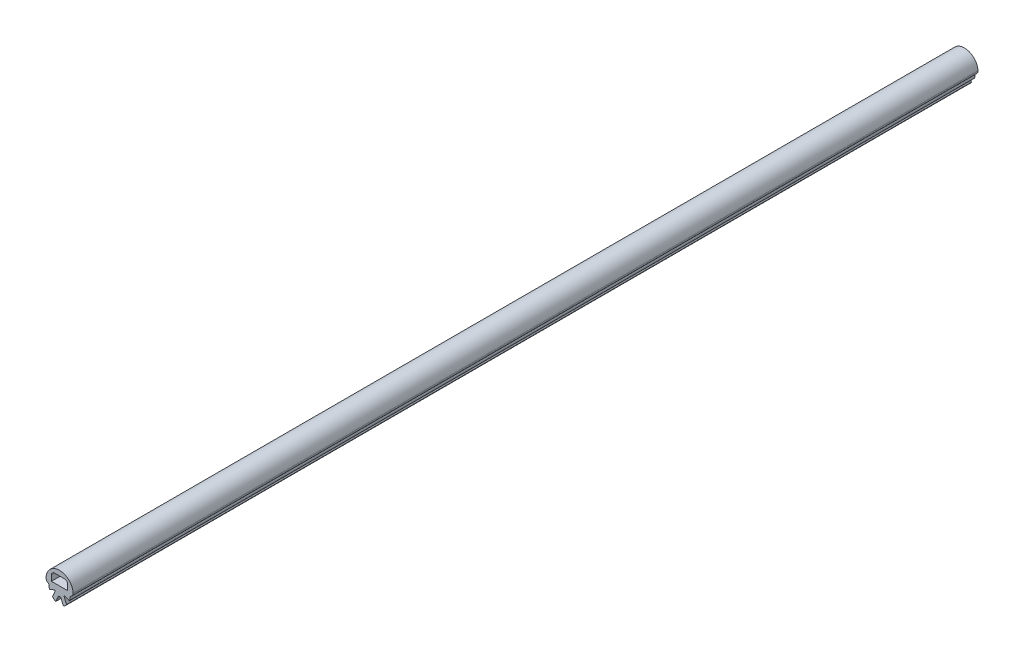
ISO-10303-21;
HEADER;
FILE_DESCRIPTION(('STEP AP214'),'2;1');
FILE_NAME('part.step','',(''),(''),'','','');
FILE_SCHEMA(('AUTOMOTIVE_DESIGN { 1 0 10303 214 1 1 1 1 }'));
ENDSEC;
DATA;
#1=APPLICATION_CONTEXT('core data for automotive mechanical design processes');
#2=APPLICATION_PROTOCOL_DEFINITION('international standard','automotive_design',2000,#1);
#3=PRODUCT_CONTEXT('',#1,'mechanical');
#4=PRODUCT('Part','Part','',(#3));
#5=PRODUCT_RELATED_PRODUCT_CATEGORY('part','',(#4));
#6=PRODUCT_DEFINITION_FORMATION('','',#4);
#7=PRODUCT_DEFINITION_CONTEXT('part definition',#1,'design');
#8=PRODUCT_DEFINITION('design','',#6,#7);
#9=PRODUCT_DEFINITION_SHAPE('','',#8);
#10=(LENGTH_UNIT() NAMED_UNIT(*) SI_UNIT(.MILLI.,.METRE.));
#11=(NAMED_UNIT(*) PLANE_ANGLE_UNIT() SI_UNIT($,.RADIAN.));
#12=(NAMED_UNIT(*) SI_UNIT($,.STERADIAN.) SOLID_ANGLE_UNIT());
#13=UNCERTAINTY_MEASURE_WITH_UNIT(LENGTH_MEASURE(1.E-05),#10,'distance_accuracy_value','');
#14=(GEOMETRIC_REPRESENTATION_CONTEXT(3) GLOBAL_UNCERTAINTY_ASSIGNED_CONTEXT((#13)) GLOBAL_UNIT_ASSIGNED_CONTEXT((#10,
#11,#12)) REPRESENTATION_CONTEXT('',''));
#15=CARTESIAN_POINT('',(0.,0.,0.));
#16=DIRECTION('',(0.,0.,1.));
#17=DIRECTION('',(1.,0.,0.));
#18=AXIS2_PLACEMENT_3D('',#15,#16,#17);
#19=CARTESIAN_POINT('',(-6.47113248654049,-11.6533832902364,17.5643148085863));
#20=DIRECTION('',(-0.866025403784436,-0.500000000000005,0.));
#21=DIRECTION('',(0.500000000000005,-0.866025403784436,0.));
#22=AXIS2_PLACEMENT_3D('',#19,#20,#21);
#23=PLANE('',#22);
#24=DIRECTION('',(0.,0.,-1.));
#25=VECTOR('',#24,1.);
#26=CARTESIAN_POINT('',(-8.95886950491573,-7.34449637854067,17.5643148085863));
#27=LINE('',#26,#25);
#28=CARTESIAN_POINT('',(-8.95886950491573,-7.34449637854067,-57.));
#29=VERTEX_POINT('',#28);
#30=CARTESIAN_POINT('',(-8.95886950491573,-7.34449637854067,-891.));
#31=VERTEX_POINT('',#30);
#32=EDGE_CURVE('E401',#29,#31,#27,.T.);
#33=ORIENTED_EDGE('',*,*,#32,.F.);
#34=DIRECTION('',(-0.500000000000005,0.866025403784436,0.));
#35=VECTOR('',#34,1.);
#36=CARTESIAN_POINT('',(-6.47113248654049,-11.6533832902364,-57.));
#37=LINE('',#36,#35);
#38=CARTESIAN_POINT('',(-9.20528257003529,-6.91769643010482,-57.));
#39=VERTEX_POINT('',#38);
#40=EDGE_CURVE('E333',#29,#39,#37,.T.);
#41=ORIENTED_EDGE('',*,*,#40,.T.);
#42=DIRECTION('',(0.,0.,-1.));
#43=VECTOR('',#42,1.);
#44=CARTESIAN_POINT('',(-9.20528257003529,-6.91769643010482,17.5643148085863));
#45=LINE('',#44,#43);
#46=CARTESIAN_POINT('',(-9.20528257003529,-6.91769643010482,-891.));
#47=VERTEX_POINT('',#46);
#48=EDGE_CURVE('E335',#39,#47,#45,.T.);
#49=ORIENTED_EDGE('',*,*,#48,.T.);
#50=DIRECTION('',(-0.500000000000005,0.866025403784436,0.));
#51=VECTOR('',#50,1.);
#52=CARTESIAN_POINT('',(-6.47113248654049,-11.6533832902364,-891.));
#53=LINE('',#52,#51);
#54=EDGE_CURVE('E372',#31,#47,#53,.T.);
#55=ORIENTED_EDGE('',*,*,#54,.F.);
#56=EDGE_LOOP('',(#33,#41,#49,#55));
#57=FACE_BOUND('',#56,.T.);
#58=ADVANCED_FACE('F48',(#57),#23,.T.);
#59=CARTESIAN_POINT('',(9.20528257003505,-6.91769643010493,17.5643148085863));
#60=DIRECTION('',(0.866025403784431,-0.500000000000013,0.));
#61=DIRECTION('',(0.500000000000013,0.866025403784431,0.));
#62=AXIS2_PLACEMENT_3D('',#59,#60,#61);
#63=PLANE('',#62);
#64=DIRECTION('',(0.,0.,1.));
#65=VECTOR('',#64,1.);
#66=CARTESIAN_POINT('',(8.95886950491558,-7.3444963785406,17.5643148085863));
#67=LINE('',#66,#65);
#68=CARTESIAN_POINT('',(8.95886950491558,-7.3444963785406,-891.));
#69=VERTEX_POINT('',#68);
#70=CARTESIAN_POINT('',(8.95886950491558,-7.3444963785406,-57.));
#71=VERTEX_POINT('',#70);
#72=EDGE_CURVE('E395',#69,#71,#67,.T.);
#73=ORIENTED_EDGE('',*,*,#72,.F.);
#74=DIRECTION('',(-0.500000000000013,-0.866025403784431,0.));
#75=VECTOR('',#74,1.);
#76=CARTESIAN_POINT('',(9.20528257003505,-6.91769643010493,-891.));
#77=LINE('',#76,#75);
#78=CARTESIAN_POINT('',(9.20528257003505,-6.91769643010492,-891.));
#79=VERTEX_POINT('',#78);
#80=EDGE_CURVE('E364',#79,#69,#77,.T.);
#81=ORIENTED_EDGE('',*,*,#80,.F.);
#82=DIRECTION('',(0.,0.,-1.));
#83=VECTOR('',#82,1.);
#84=CARTESIAN_POINT('',(9.20528257003505,-6.91769643010492,17.5643148085863));
#85=LINE('',#84,#83);
#86=CARTESIAN_POINT('',(9.20528257003505,-6.91769643010492,-57.));
#87=VERTEX_POINT('',#86);
#88=EDGE_CURVE('E321',#87,#79,#85,.T.);
#89=ORIENTED_EDGE('',*,*,#88,.F.);
#90=DIRECTION('',(-0.500000000000013,-0.866025403784431,0.));
#91=VECTOR('',#90,1.);
#92=CARTESIAN_POINT('',(9.20528257003505,-6.91769643010493,-57.));
#93=LINE('',#92,#91);
#94=EDGE_CURVE('E329',#87,#71,#93,.T.);
#95=ORIENTED_EDGE('',*,*,#94,.T.);
#96=EDGE_LOOP('',(#73,#81,#89,#95));
#97=FACE_BOUND('',#96,.T.);
#98=ADVANCED_FACE('F437',(#97),#63,.T.);
#99=CARTESIAN_POINT('',(8.50059730669662,0.499492278712982,17.5643148085863));
#100=DIRECTION('',(0.,0.,-1.));
#101=DIRECTION('',(-1.,0.,0.));
#102=AXIS2_PLACEMENT_3D('',#99,#100,#101);
#103=CYLINDRICAL_SURFACE('',#102,4.00000000000114);
#104=DIRECTION('',(0.,0.,-1.));
#105=VECTOR('',#104,1.);
#106=CARTESIAN_POINT('',(12.4961385352011,0.310679431347746,-474.));
#107=LINE('',#106,#105);
#108=CARTESIAN_POINT('',(12.4961385352011,0.310679431347746,-56.9999999999999));
#109=VERTEX_POINT('',#108);
#110=CARTESIAN_POINT('',(12.4961385352011,0.310679431347746,-891.));
#111=VERTEX_POINT('',#110);
#112=EDGE_CURVE('E342',#109,#111,#107,.T.);
#113=ORIENTED_EDGE('',*,*,#112,.F.);
#114=CARTESIAN_POINT('',(8.50059730669662,0.499492278712982,-57.));
#115=DIRECTION('',(0.,0.,1.));
#116=DIRECTION('',(1.,0.,0.));
#117=AXIS2_PLACEMENT_3D('',#114,#115,#116);
#118=CIRCLE('',#117,4.00000000000114);
#119=CARTESIAN_POINT('',(9.43762749865645,-3.38920601497925,-57.));
#120=VERTEX_POINT('',#119);
#121=EDGE_CURVE('E312',#109,#120,#118,.F.);
#122=ORIENTED_EDGE('',*,*,#121,.T.);
#123=DIRECTION('',(0.,0.,-1.));
#124=VECTOR('',#123,1.);
#125=CARTESIAN_POINT('',(9.43762749865645,-3.38920601497925,17.5643148085863));
#126=LINE('',#125,#124);
#127=CARTESIAN_POINT('',(9.43762749865645,-3.38920601497925,-891.));
#128=VERTEX_POINT('',#127);
#129=EDGE_CURVE('E317',#120,#128,#126,.T.);
#130=ORIENTED_EDGE('',*,*,#129,.T.);
#131=CARTESIAN_POINT('',(8.50059730669662,0.499492278712982,-891.));
#132=DIRECTION('',(0.,0.,-1.));
#133=DIRECTION('',(-1.,0.,0.));
#134=AXIS2_PLACEMENT_3D('',#131,#132,#133);
#135=CIRCLE('',#134,4.00000000000114);
#136=EDGE_CURVE('E358',#111,#128,#135,.T.);
#137=ORIENTED_EDGE('',*,*,#136,.F.);
#138=EDGE_LOOP('',(#113,#122,#130,#137));
#139=FACE_BOUND('',#138,.T.);
#140=ADVANCED_FACE('F444',(#139),#103,.T.);
#141=CARTESIAN_POINT('',(-8.50059730669262,0.499492278712978,17.5643148085863));
#142=DIRECTION('',(0.,0.,-1.));
#143=DIRECTION('',(-1.,0.,0.));
#144=AXIS2_PLACEMENT_3D('',#141,#142,#143);
#145=CYLINDRICAL_SURFACE('',#144,4.00000000000114);
#146=DIRECTION('',(0.,0.,-1.));
#147=VECTOR('',#146,1.);
#148=CARTESIAN_POINT('',(-12.4961385351997,0.310679431403244,-474.));
#149=LINE('',#148,#147);
#150=CARTESIAN_POINT('',(-12.4961385351997,0.310679431403244,-891.));
#151=VERTEX_POINT('',#150);
#152=CARTESIAN_POINT('',(-12.4961385351997,0.310679431403244,-57.));
#153=VERTEX_POINT('',#152);
#154=EDGE_CURVE('E316',#151,#153,#149,.F.);
#155=ORIENTED_EDGE('',*,*,#154,.F.);
#156=CARTESIAN_POINT('',(-8.50059730669262,0.499492278712978,-891.));
#157=DIRECTION('',(0.,0.,-1.));
#158=DIRECTION('',(-1.,0.,0.));
#159=AXIS2_PLACEMENT_3D('',#156,#157,#158);
#160=CIRCLE('',#159,4.00000000000114);
#161=CARTESIAN_POINT('',(-9.43762749865635,-3.38920601497831,-891.));
#162=VERTEX_POINT('',#161);
#163=EDGE_CURVE('E346',#162,#151,#160,.T.);
#164=ORIENTED_EDGE('',*,*,#163,.F.);
#165=DIRECTION('',(0.,0.,-1.));
#166=VECTOR('',#165,1.);
#167=CARTESIAN_POINT('',(-9.43762749865635,-3.38920601497831,17.5643148085863));
#168=LINE('',#167,#166);
#169=CARTESIAN_POINT('',(-9.43762749865635,-3.38920601497831,-57.));
#170=VERTEX_POINT('',#169);
#171=EDGE_CURVE('E340',#170,#162,#168,.T.);
#172=ORIENTED_EDGE('',*,*,#171,.F.);
#173=CARTESIAN_POINT('',(-8.50059730669262,0.499492278712978,-57.));
#174=DIRECTION('',(0.,0.,1.));
#175=DIRECTION('',(1.,0.,0.));
#176=AXIS2_PLACEMENT_3D('',#173,#174,#175);
#177=CIRCLE('',#176,4.00000000000114);
#178=EDGE_CURVE('E320',#170,#153,#177,.F.);
#179=ORIENTED_EDGE('',*,*,#178,.T.);
#180=EDGE_LOOP('',(#155,#164,#172,#179));
#181=FACE_BOUND('',#180,.T.);
#182=ADVANCED_FACE('F50',(#181),#145,.T.);
#183=CARTESIAN_POINT('',(-5.49999999999569,-1.50000000000011,-891.));
#184=DIRECTION('',(0.,0.,-1.));
#185=DIRECTION('',(-1.,0.,0.));
#186=AXIS2_PLACEMENT_3D('',#183,#184,#185);
#187=PLANE('',#186);
#188=DIRECTION('',(0.,-1.,0.));
#189=VECTOR('',#188,1.);
#190=CARTESIAN_POINT('',(7.5,0.,-891.));
#191=LINE('',#190,#189);
#192=CARTESIAN_POINT('',(7.5,4.99999999999998,-891.));
#193=VERTEX_POINT('',#192);
#194=CARTESIAN_POINT('',(7.5,0.,-891.));
#195=VERTEX_POINT('',#194);
#196=EDGE_CURVE('E63',#193,#195,#191,.T.);
#197=ORIENTED_EDGE('',*,*,#196,.F.);
#198=CARTESIAN_POINT('',(4.5,5.,-891.));
#199=DIRECTION('',(0.,0.,-1.));
#200=DIRECTION('',(1.,0.,0.));
#201=AXIS2_PLACEMENT_3D('',#198,#199,#200);
#202=CIRCLE('',#201,3.);
#203=CARTESIAN_POINT('',(4.49999999999998,8.,-891.));
#204=VERTEX_POINT('',#203);
#205=EDGE_CURVE('E248',#204,#193,#202,.T.);
#206=ORIENTED_EDGE('',*,*,#205,.F.);
#207=DIRECTION('',(1.,0.,0.));
#208=VECTOR('',#207,1.);
#209=CARTESIAN_POINT('',(4.49999999999998,8.,-891.));
#210=LINE('',#209,#208);
#211=CARTESIAN_POINT('',(-4.49999999999998,8.,-891.));
#212=VERTEX_POINT('',#211);
#213=EDGE_CURVE('E242',#212,#204,#210,.T.);
#214=ORIENTED_EDGE('',*,*,#213,.F.);
#215=CARTESIAN_POINT('',(-4.5,5.,-891.));
#216=DIRECTION('',(0.,0.,-1.));
#217=DIRECTION('',(1.,0.,0.));
#218=AXIS2_PLACEMENT_3D('',#215,#216,#217);
#219=CIRCLE('',#218,3.);
#220=CARTESIAN_POINT('',(-7.5,4.99999999999998,-891.));
#221=VERTEX_POINT('',#220);
#222=EDGE_CURVE('E240',#221,#212,#219,.T.);
#223=ORIENTED_EDGE('',*,*,#222,.F.);
#224=DIRECTION('',(0.,1.,0.));
#225=VECTOR('',#224,1.);
#226=CARTESIAN_POINT('',(-7.5,0.,-891.));
#227=LINE('',#226,#225);
#228=CARTESIAN_POINT('',(-7.5,0.,-891.));
#229=VERTEX_POINT('',#228);
#230=EDGE_CURVE('E223',#229,#221,#227,.T.);
#231=ORIENTED_EDGE('',*,*,#230,.F.);
#232=DIRECTION('',(-1.,0.,0.));
#233=VECTOR('',#232,1.);
#234=CARTESIAN_POINT('',(7.5,0.,-891.));
#235=LINE('',#234,#233);
#236=EDGE_CURVE('E232',#195,#229,#235,.T.);
#237=ORIENTED_EDGE('',*,*,#236,.F.);
#238=EDGE_LOOP('',(#197,#206,#214,#223,#231,#237));
#239=FACE_BOUND('',#238,.T.);
#240=DIRECTION('',(0.910826243995696,0.412789962630747,0.));
#241=VECTOR('',#240,1.);
#242=CARTESIAN_POINT('',(-9.08644720520006,-7.40231508378774,-891.));
#243=LINE('',#242,#241);
#244=CARTESIAN_POINT('',(-4.53231598522158,-5.33836527063401,-891.));
#245=VERTEX_POINT('',#244);
#246=EDGE_CURVE('E264',#31,#245,#243,.T.);
#247=ORIENTED_EDGE('',*,*,#246,.F.);
#248=ORIENTED_EDGE('',*,*,#54,.T.);
#249=CARTESIAN_POINT('',(-5.74118095489754,-4.9176964301048,-891.));
#250=DIRECTION('',(0.,0.,-1.));
#251=DIRECTION('',(-1.,0.,0.));
#252=AXIS2_PLACEMENT_3D('',#249,#250,#251);
#253=CIRCLE('',#252,4.);
#254=EDGE_CURVE('E376',#47,#162,#253,.T.);
#255=ORIENTED_EDGE('',*,*,#254,.T.);
#256=ORIENTED_EDGE('',*,*,#163,.T.);
#257=CARTESIAN_POINT('',(0.,0.,-891.));
#258=DIRECTION('',(0.,0.,1.));
#259=DIRECTION('',(-1.,0.,0.));
#260=AXIS2_PLACEMENT_3D('',#257,#258,#259);
#261=CIRCLE('',#260,12.5);
#262=EDGE_CURVE('E382',#111,#151,#261,.T.);
#263=ORIENTED_EDGE('',*,*,#262,.F.);
#264=ORIENTED_EDGE('',*,*,#136,.T.);
#265=CARTESIAN_POINT('',(5.7411809548973,-4.91769643010491,-891.));
#266=DIRECTION('',(0.,0.,-1.));
#267=DIRECTION('',(-1.,0.,0.));
#268=AXIS2_PLACEMENT_3D('',#265,#266,#267);
#269=CIRCLE('',#268,4.);
#270=EDGE_CURVE('E360',#128,#79,#269,.T.);
#271=ORIENTED_EDGE('',*,*,#270,.T.);
#272=ORIENTED_EDGE('',*,*,#80,.T.);
#273=DIRECTION('',(0.910826243995696,-0.412789962630747,0.));
#274=VECTOR('',#273,1.);
#275=CARTESIAN_POINT('',(9.08644720520006,-7.40231508378774,-891.));
#276=LINE('',#275,#274);
#277=CARTESIAN_POINT('',(4.53231598522158,-5.33836527063401,-891.));
#278=VERTEX_POINT('',#277);
#279=EDGE_CURVE('E281',#278,#69,#276,.T.);
#280=ORIENTED_EDGE('',*,*,#279,.F.);
#281=DIRECTION('',(0.412789962630747,0.910826243995696,0.));
#282=VECTOR('',#281,1.);
#283=CARTESIAN_POINT('',(4.53231598522158,-5.33836527063401,-891.));
#284=LINE('',#283,#282);
#285=CARTESIAN_POINT('',(4.11952602259083,-6.24919151462971,-891.));
#286=VERTEX_POINT('',#285);
#287=EDGE_CURVE('E278',#286,#278,#284,.T.);
#288=ORIENTED_EDGE('',*,*,#287,.F.);
#289=DIRECTION('',(-0.408909590842513,0.912574899127194,0.));
#290=VECTOR('',#289,1.);
#291=CARTESIAN_POINT('',(4.11952602259083,-6.24919151462971,-891.));
#292=LINE('',#291,#290);
#293=CARTESIAN_POINT('',(6.51050054542626,-11.5851958120505,-891.));
#294=VERTEX_POINT('',#293);
#295=EDGE_CURVE('E275',#294,#286,#292,.T.);
#296=ORIENTED_EDGE('',*,*,#295,.F.);
#297=CARTESIAN_POINT('',(6.47113248654022,-11.6533832902365,-891.));
#298=VERTEX_POINT('',#297);
#299=EDGE_CURVE('E363',#294,#298,#77,.T.);
#300=ORIENTED_EDGE('',*,*,#299,.T.);
#301=CARTESIAN_POINT('',(1.70799276572585,-8.90338329023642,-891.));
#302=DIRECTION('',(0.,0.,-1.));
#303=DIRECTION('',(-1.,0.,0.));
#304=AXIS2_PLACEMENT_3D('',#301,#302,#303);
#305=CIRCLE('',#304,5.5);
#306=CARTESIAN_POINT('',(3.49999999999998,-14.1032592572484,-891.));
#307=VERTEX_POINT('',#306);
#308=EDGE_CURVE('E367',#298,#307,#305,.T.);
#309=ORIENTED_EDGE('',*,*,#308,.T.);
#310=DIRECTION('',(0.401668825352325,-0.915784993729469,0.));
#311=VECTOR('',#310,1.);
#312=CARTESIAN_POINT('',(-2.5880522620679,-0.222802147458822,-891.));
#313=LINE('',#312,#311);
#314=CARTESIAN_POINT('',(0.999999999999997,-8.40338329023642,-891.));
#315=VERTEX_POINT('',#314);
#316=EDGE_CURVE('E306',#315,#307,#313,.T.);
#317=ORIENTED_EDGE('',*,*,#316,.F.);
#318=DIRECTION('',(1.,0.,0.));
#319=VECTOR('',#318,1.);
#320=CARTESIAN_POINT('',(-5.49999999999569,-8.40338329023642,-891.));
#321=LINE('',#320,#319);
#322=CARTESIAN_POINT('',(-1.,-8.40338329023642,-891.));
#323=VERTEX_POINT('',#322);
#324=EDGE_CURVE('E309',#323,#315,#321,.T.);
#325=ORIENTED_EDGE('',*,*,#324,.F.);
#326=DIRECTION('',(0.401668825352324,0.91578499372947,0.));
#327=VECTOR('',#326,1.);
#328=CARTESIAN_POINT('',(0.813335964210203,-4.26906725722826,-891.));
#329=LINE('',#328,#327);
#330=CARTESIAN_POINT('',(-3.50000000000002,-14.1032592572485,-891.));
#331=VERTEX_POINT('',#330);
#332=EDGE_CURVE('E300',#331,#323,#329,.T.);
#333=ORIENTED_EDGE('',*,*,#332,.F.);
#334=CARTESIAN_POINT('',(-1.70799276572609,-8.90338329023643,-891.));
#335=DIRECTION('',(0.,0.,-1.));
#336=DIRECTION('',(-1.,0.,0.));
#337=AXIS2_PLACEMENT_3D('',#334,#335,#336);
#338=CIRCLE('',#337,5.49999999999999);
#339=CARTESIAN_POINT('',(-6.47113248654049,-11.6533832902364,-891.));
#340=VERTEX_POINT('',#339);
#341=EDGE_CURVE('E370',#331,#340,#338,.T.);
#342=ORIENTED_EDGE('',*,*,#341,.T.);
#343=CARTESIAN_POINT('',(-6.51050054542636,-11.5851958120507,-891.));
#344=VERTEX_POINT('',#343);
#345=EDGE_CURVE('E373',#340,#344,#53,.T.);
#346=ORIENTED_EDGE('',*,*,#345,.T.);
#347=DIRECTION('',(-0.408909590842513,-0.912574899127194,0.));
#348=VECTOR('',#347,1.);
#349=CARTESIAN_POINT('',(-4.11952602259083,-6.24919151462971,-891.));
#350=LINE('',#349,#348);
#351=CARTESIAN_POINT('',(-4.11952602259083,-6.24919151462971,-891.));
#352=VERTEX_POINT('',#351);
#353=EDGE_CURVE('E262',#352,#344,#350,.T.);
#354=ORIENTED_EDGE('',*,*,#353,.F.);
#355=DIRECTION('',(0.412789962630747,-0.910826243995696,0.));
#356=VECTOR('',#355,1.);
#357=CARTESIAN_POINT('',(-4.53231598522158,-5.33836527063401,-891.));
#358=LINE('',#357,#356);
#359=EDGE_CURVE('E253',#245,#352,#358,.T.);
#360=ORIENTED_EDGE('',*,*,#359,.F.);
#361=EDGE_LOOP('',(#247,#248,#255,#256,#263,#264,#271,#272,#280,#288,#296,#300,#309,#317,#325,
#333,#342,#346,#354,#360));
#362=FACE_BOUND('',#361,.T.);
#363=ADVANCED_FACE('F236',(#239,#362),#187,.T.);
#364=CARTESIAN_POINT('',(1.31750928753943E-12,4.03765428455148,-57.));
#365=DIRECTION('',(0.,0.,1.));
#366=DIRECTION('',(1.,0.,0.));
#367=AXIS2_PLACEMENT_3D('',#364,#365,#366);
#368=PLANE('',#367);
#369=DIRECTION('',(0.,1.,0.));
#370=VECTOR('',#369,1.);
#371=CARTESIAN_POINT('',(7.5,4.03765428455148,-57.));
#372=LINE('',#371,#370);
#373=CARTESIAN_POINT('',(7.5,0.,-57.));
#374=VERTEX_POINT('',#373);
#375=CARTESIAN_POINT('',(7.5,4.99999999999998,-57.));
#376=VERTEX_POINT('',#375);
#377=EDGE_CURVE('E13',#374,#376,#372,.T.);
#378=ORIENTED_EDGE('',*,*,#377,.F.);
#379=DIRECTION('',(1.,0.,0.));
#380=VECTOR('',#379,1.);
#381=CARTESIAN_POINT('',(1.31704233996108E-12,0.,-57.));
#382=LINE('',#381,#380);
#383=CARTESIAN_POINT('',(-7.5,0.,-57.));
#384=VERTEX_POINT('',#383);
#385=EDGE_CURVE('E405',#384,#374,#382,.T.);
#386=ORIENTED_EDGE('',*,*,#385,.F.);
#387=DIRECTION('',(0.,-1.,0.));
#388=VECTOR('',#387,1.);
#389=CARTESIAN_POINT('',(-7.5,4.03765428455148,-57.));
#390=LINE('',#389,#388);
#391=CARTESIAN_POINT('',(-7.5,4.99999999999998,-57.));
#392=VERTEX_POINT('',#391);
#393=EDGE_CURVE('E226',#392,#384,#390,.T.);
#394=ORIENTED_EDGE('',*,*,#393,.F.);
#395=CARTESIAN_POINT('',(-4.5,5.,-57.));
#396=DIRECTION('',(0.,0.,1.));
#397=DIRECTION('',(1.,0.,0.));
#398=AXIS2_PLACEMENT_3D('',#395,#396,#397);
#399=CIRCLE('',#398,3.);
#400=CARTESIAN_POINT('',(-4.49999999999998,8.,-57.));
#401=VERTEX_POINT('',#400);
#402=EDGE_CURVE('E408',#401,#392,#399,.T.);
#403=ORIENTED_EDGE('',*,*,#402,.F.);
#404=DIRECTION('',(-1.,0.,0.));
#405=VECTOR('',#404,1.);
#406=CARTESIAN_POINT('',(1.3182730179986E-12,8.,-57.));
#407=LINE('',#406,#405);
#408=CARTESIAN_POINT('',(4.49999999999998,8.,-57.));
#409=VERTEX_POINT('',#408);
#410=EDGE_CURVE('E410',#409,#401,#407,.T.);
#411=ORIENTED_EDGE('',*,*,#410,.F.);
#412=CARTESIAN_POINT('',(4.5,5.,-57.));
#413=DIRECTION('',(0.,0.,1.));
#414=DIRECTION('',(1.,0.,0.));
#415=AXIS2_PLACEMENT_3D('',#412,#413,#414);
#416=CIRCLE('',#415,3.);
#417=EDGE_CURVE('E56',#376,#409,#416,.T.);
#418=ORIENTED_EDGE('',*,*,#417,.F.);
#419=EDGE_LOOP('',(#378,#386,#394,#403,#411,#418));
#420=FACE_BOUND('',#419,.T.);
#421=DIRECTION('',(-0.910826243995696,-0.412789962630747,0.));
#422=VECTOR('',#421,1.);
#423=CARTESIAN_POINT('',(2.75290869769695,-2.03667337885674,-57.));
#424=LINE('',#423,#422);
#425=CARTESIAN_POINT('',(-4.53231598522158,-5.33836527063401,-57.));
#426=VERTEX_POINT('',#425);
#427=EDGE_CURVE('E273',#426,#29,#424,.T.);
#428=ORIENTED_EDGE('',*,*,#427,.F.);
#429=DIRECTION('',(-0.412789962630747,0.910826243995696,0.));
#430=VECTOR('',#429,1.);
#431=CARTESIAN_POINT('',(-7.28522468291721,0.735962392774212,-57.));
#432=LINE('',#431,#430);
#433=CARTESIAN_POINT('',(-4.11952602259083,-6.24919151462971,-57.));
#434=VERTEX_POINT('',#433);
#435=EDGE_CURVE('E403',#434,#426,#432,.T.);
#436=ORIENTED_EDGE('',*,*,#435,.F.);
#437=DIRECTION('',(0.408909590842513,0.912574899127194,0.));
#438=VECTOR('',#437,1.);
#439=CARTESIAN_POINT('',(0.407933630283888,3.85486602902387,-57.));
#440=LINE('',#439,#438);
#441=CARTESIAN_POINT('',(-6.51050054542636,-11.5851958120507,-57.));
#442=VERTEX_POINT('',#441);
#443=EDGE_CURVE('E270',#442,#434,#440,.T.);
#444=ORIENTED_EDGE('',*,*,#443,.F.);
#445=CARTESIAN_POINT('',(-6.47113248654049,-11.6533832902364,-57.));
#446=VERTEX_POINT('',#445);
#447=EDGE_CURVE('E339',#446,#442,#37,.T.);
#448=ORIENTED_EDGE('',*,*,#447,.F.);
#449=CARTESIAN_POINT('',(-1.70799276572609,-8.90338329023643,-57.));
#450=DIRECTION('',(0.,0.,1.));
#451=DIRECTION('',(1.,0.,0.));
#452=AXIS2_PLACEMENT_3D('',#449,#450,#451);
#453=CIRCLE('',#452,5.49999999999999);
#454=CARTESIAN_POINT('',(-3.50000000000002,-14.1032592572485,-57.));
#455=VERTEX_POINT('',#454);
#456=EDGE_CURVE('E334',#455,#446,#453,.F.);
#457=ORIENTED_EDGE('',*,*,#456,.F.);
#458=DIRECTION('',(-0.401668825352324,-0.91578499372947,0.));
#459=VECTOR('',#458,1.);
#460=CARTESIAN_POINT('',(3.7376775060087,2.39828637214464,-57.));
#461=LINE('',#460,#459);
#462=CARTESIAN_POINT('',(-1.,-8.40338329023642,-57.));
#463=VERTEX_POINT('',#462);
#464=EDGE_CURVE('E297',#463,#455,#461,.T.);
#465=ORIENTED_EDGE('',*,*,#464,.F.);
#466=DIRECTION('',(-1.,0.,0.));
#467=VECTOR('',#466,1.);
#468=CARTESIAN_POINT('',(1.31750928753943E-12,-8.40338329023642,-57.));
#469=LINE('',#468,#467);
#470=CARTESIAN_POINT('',(0.999999999999997,-8.40338329023642,-57.));
#471=VERTEX_POINT('',#470);
#472=EDGE_CURVE('E390',#471,#463,#469,.T.);
#473=ORIENTED_EDGE('',*,*,#472,.F.);
#474=DIRECTION('',(-0.401668825352325,0.915784993729469,0.));
#475=VECTOR('',#474,1.);
#476=CARTESIAN_POINT('',(-3.73767750600829,2.39828637214366,-57.));
#477=LINE('',#476,#475);
#478=CARTESIAN_POINT('',(3.49999999999998,-14.1032592572484,-57.));
#479=VERTEX_POINT('',#478);
#480=EDGE_CURVE('E303',#479,#471,#477,.T.);
#481=ORIENTED_EDGE('',*,*,#480,.F.);
#482=CARTESIAN_POINT('',(1.70799276572585,-8.90338329023642,-57.));
#483=DIRECTION('',(0.,0.,1.));
#484=DIRECTION('',(1.,0.,0.));
#485=AXIS2_PLACEMENT_3D('',#482,#483,#484);
#486=CIRCLE('',#485,5.5);
#487=CARTESIAN_POINT('',(6.47113248654023,-11.6533832902365,-57.));
#488=VERTEX_POINT('',#487);
#489=EDGE_CURVE('E328',#488,#479,#486,.F.);
#490=ORIENTED_EDGE('',*,*,#489,.F.);
#491=CARTESIAN_POINT('',(6.51050054542626,-11.5851958120505,-57.));
#492=VERTEX_POINT('',#491);
#493=EDGE_CURVE('E323',#492,#488,#93,.T.);
#494=ORIENTED_EDGE('',*,*,#493,.F.);
#495=DIRECTION('',(0.408909590842513,-0.912574899127194,0.));
#496=VECTOR('',#495,1.);
#497=CARTESIAN_POINT('',(-0.407933630283447,3.85486602902288,-57.));
#498=LINE('',#497,#496);
#499=CARTESIAN_POINT('',(4.11952602259083,-6.24919151462971,-57.));
#500=VERTEX_POINT('',#499);
#501=EDGE_CURVE('E286',#500,#492,#498,.T.);
#502=ORIENTED_EDGE('',*,*,#501,.F.);
#503=DIRECTION('',(-0.412789962630747,-0.910826243995696,0.));
#504=VECTOR('',#503,1.);
#505=CARTESIAN_POINT('',(7.28522468291766,0.735962392775203,-57.));
#506=LINE('',#505,#504);
#507=CARTESIAN_POINT('',(4.53231598522158,-5.33836527063401,-57.));
#508=VERTEX_POINT('',#507);
#509=EDGE_CURVE('E397',#508,#500,#506,.T.);
#510=ORIENTED_EDGE('',*,*,#509,.F.);
#511=DIRECTION('',(-0.910826243995696,0.412789962630747,0.));
#512=VECTOR('',#511,1.);
#513=CARTESIAN_POINT('',(-2.75290869769476,-2.03667337885773,-57.));
#514=LINE('',#513,#512);
#515=EDGE_CURVE('E289',#71,#508,#514,.T.);
#516=ORIENTED_EDGE('',*,*,#515,.F.);
#517=ORIENTED_EDGE('',*,*,#94,.F.);
#518=CARTESIAN_POINT('',(5.7411809548973,-4.91769643010491,-57.));
#519=DIRECTION('',(0.,0.,1.));
#520=DIRECTION('',(1.,0.,0.));
#521=AXIS2_PLACEMENT_3D('',#518,#519,#520);
#522=CIRCLE('',#521,4.);
#523=EDGE_CURVE('E324',#120,#87,#522,.F.);
#524=ORIENTED_EDGE('',*,*,#523,.F.);
#525=ORIENTED_EDGE('',*,*,#121,.F.);
#526=CARTESIAN_POINT('',(0.,0.,-57.));
#527=DIRECTION('',(0.,0.,1.));
#528=DIRECTION('',(1.,0.,0.));
#529=AXIS2_PLACEMENT_3D('',#526,#527,#528);
#530=CIRCLE('',#529,12.5);
#531=EDGE_CURVE('E313',#153,#109,#530,.F.);
#532=ORIENTED_EDGE('',*,*,#531,.F.);
#533=ORIENTED_EDGE('',*,*,#178,.F.);
#534=CARTESIAN_POINT('',(-5.74118095489754,-4.9176964301048,-57.));
#535=DIRECTION('',(0.,0.,1.));
#536=DIRECTION('',(1.,0.,0.));
#537=AXIS2_PLACEMENT_3D('',#534,#535,#536);
#538=CIRCLE('',#537,4.);
#539=EDGE_CURVE('E338',#39,#170,#538,.F.);
#540=ORIENTED_EDGE('',*,*,#539,.F.);
#541=ORIENTED_EDGE('',*,*,#40,.F.);
#542=EDGE_LOOP('',(#428,#436,#444,#448,#457,#465,#473,#481,#490,#494,#502,#510,#516,#517,#524,
#525,#532,#533,#540,#541));
#543=FACE_BOUND('',#542,.T.);
#544=ADVANCED_FACE('F424',(#420,#543),#368,.T.);
#545=CARTESIAN_POINT('',(5.7411809548973,-4.91769643010491,17.5643148085863));
#546=DIRECTION('',(0.,0.,-1.));
#547=DIRECTION('',(-1.,0.,0.));
#548=AXIS2_PLACEMENT_3D('',#545,#546,#547);
#549=CYLINDRICAL_SURFACE('',#548,4.);
#550=ORIENTED_EDGE('',*,*,#129,.F.);
#551=ORIENTED_EDGE('',*,*,#523,.T.);
#552=ORIENTED_EDGE('',*,*,#88,.T.);
#553=ORIENTED_EDGE('',*,*,#270,.F.);
#554=EDGE_LOOP('',(#550,#551,#552,#553));
#555=FACE_BOUND('',#554,.T.);
#556=ADVANCED_FACE('F504',(#555),#549,.T.);
#557=DIRECTION('',(0.,0.,-1.));
#558=VECTOR('',#557,1.);
#559=CARTESIAN_POINT('',(6.51050054542626,-11.5851958120505,17.5643148085863));
#560=LINE('',#559,#558);
#561=EDGE_CURVE('E393',#492,#294,#560,.T.);
#562=ORIENTED_EDGE('',*,*,#561,.F.);
#563=ORIENTED_EDGE('',*,*,#493,.T.);
#564=DIRECTION('',(0.,0.,-1.));
#565=VECTOR('',#564,1.);
#566=CARTESIAN_POINT('',(6.47113248654022,-11.6533832902365,17.5643148085863));
#567=LINE('',#566,#565);
#568=EDGE_CURVE('E325',#488,#298,#567,.T.);
#569=ORIENTED_EDGE('',*,*,#568,.T.);
#570=ORIENTED_EDGE('',*,*,#299,.F.);
#571=EDGE_LOOP('',(#562,#563,#569,#570));
#572=FACE_BOUND('',#571,.T.);
#573=ADVANCED_FACE('F447',(#572),#63,.T.);
#574=CARTESIAN_POINT('',(1.70799276572585,-8.90338329023642,17.5643148085863));
#575=DIRECTION('',(0.,0.,-1.));
#576=DIRECTION('',(-1.,0.,0.));
#577=AXIS2_PLACEMENT_3D('',#574,#575,#576);
#578=CYLINDRICAL_SURFACE('',#577,5.5);
#579=DIRECTION('',(0.,0.,-1.));
#580=VECTOR('',#579,1.);
#581=CARTESIAN_POINT('',(3.49999999999998,-14.1032592572484,17.5643148085863));
#582=LINE('',#581,#580);
#583=EDGE_CURVE('E387',#307,#479,#582,.F.);
#584=ORIENTED_EDGE('',*,*,#583,.F.);
#585=ORIENTED_EDGE('',*,*,#308,.F.);
#586=ORIENTED_EDGE('',*,*,#568,.F.);
#587=ORIENTED_EDGE('',*,*,#489,.T.);
#588=EDGE_LOOP('',(#584,#585,#586,#587));
#589=FACE_BOUND('',#588,.T.);
#590=ADVANCED_FACE('F461',(#589),#578,.T.);
#591=CARTESIAN_POINT('',(-1.70799276572609,-8.90338329023643,17.5643148085863));
#592=DIRECTION('',(0.,0.,-1.));
#593=DIRECTION('',(-1.,0.,0.));
#594=AXIS2_PLACEMENT_3D('',#591,#592,#593);
#595=CYLINDRICAL_SURFACE('',#594,5.49999999999999);
#596=DIRECTION('',(0.,0.,-1.));
#597=VECTOR('',#596,1.);
#598=CARTESIAN_POINT('',(-3.50000000000002,-14.1032592572485,17.5643148085863));
#599=LINE('',#598,#597);
#600=EDGE_CURVE('E315',#455,#331,#599,.T.);
#601=ORIENTED_EDGE('',*,*,#600,.F.);
#602=ORIENTED_EDGE('',*,*,#456,.T.);
#603=DIRECTION('',(0.,0.,-1.));
#604=VECTOR('',#603,1.);
#605=CARTESIAN_POINT('',(-6.47113248654049,-11.6533832902364,17.5643148085863));
#606=LINE('',#605,#604);
#607=EDGE_CURVE('E330',#446,#340,#606,.T.);
#608=ORIENTED_EDGE('',*,*,#607,.T.);
#609=ORIENTED_EDGE('',*,*,#341,.F.);
#610=EDGE_LOOP('',(#601,#602,#608,#609));
#611=FACE_BOUND('',#610,.T.);
#612=ADVANCED_FACE('F453',(#611),#595,.T.);
#613=DIRECTION('',(0.,0.,1.));
#614=VECTOR('',#613,1.);
#615=CARTESIAN_POINT('',(-6.51050054542636,-11.5851958120507,17.5643148085863));
#616=LINE('',#615,#614);
#617=EDGE_CURVE('E399',#344,#442,#616,.T.);
#618=ORIENTED_EDGE('',*,*,#617,.F.);
#619=ORIENTED_EDGE('',*,*,#345,.F.);
#620=ORIENTED_EDGE('',*,*,#607,.F.);
#621=ORIENTED_EDGE('',*,*,#447,.T.);
#622=EDGE_LOOP('',(#618,#619,#620,#621));
#623=FACE_BOUND('',#622,.T.);
#624=ADVANCED_FACE('F440',(#623),#23,.T.);
#625=CARTESIAN_POINT('',(-5.74118095489754,-4.9176964301048,17.5643148085863));
#626=DIRECTION('',(0.,0.,-1.));
#627=DIRECTION('',(-1.,0.,0.));
#628=AXIS2_PLACEMENT_3D('',#625,#626,#627);
#629=CYLINDRICAL_SURFACE('',#628,4.);
#630=ORIENTED_EDGE('',*,*,#48,.F.);
#631=ORIENTED_EDGE('',*,*,#539,.T.);
#632=ORIENTED_EDGE('',*,*,#171,.T.);
#633=ORIENTED_EDGE('',*,*,#254,.F.);
#634=EDGE_LOOP('',(#630,#631,#632,#633));
#635=FACE_BOUND('',#634,.T.);
#636=ADVANCED_FACE('F452',(#635),#629,.T.);
#637=CARTESIAN_POINT('',(0.,0.,-56.9999999999999));
#638=DIRECTION('',(0.,0.,-1.));
#639=DIRECTION('',(-1.,0.,0.));
#640=AXIS2_PLACEMENT_3D('',#637,#638,#639);
#641=CYLINDRICAL_SURFACE('',#640,12.5);
#642=ORIENTED_EDGE('',*,*,#112,.T.);
#643=ORIENTED_EDGE('',*,*,#262,.T.);
#644=ORIENTED_EDGE('',*,*,#154,.T.);
#645=ORIENTED_EDGE('',*,*,#531,.T.);
#646=EDGE_LOOP('',(#642,#643,#644,#645));
#647=FACE_BOUND('',#646,.T.);
#648=ADVANCED_FACE('F459',(#647),#641,.T.);
#649=CARTESIAN_POINT('',(0.999999999999997,-8.40338329023642,-2977.02098240551));
#650=DIRECTION('',(0.915784993729469,0.401668825352325,0.));
#651=DIRECTION('',(-0.401668825352325,0.915784993729469,0.));
#652=AXIS2_PLACEMENT_3D('',#649,#650,#651);
#653=PLANE('',#652);
#654=DIRECTION('',(0.,0.,1.));
#655=VECTOR('',#654,1.);
#656=CARTESIAN_POINT('',(0.999999999999997,-8.40338329023642,-2977.02098240551));
#657=LINE('',#656,#655);
#658=EDGE_CURVE('E294',#315,#471,#657,.T.);
#659=ORIENTED_EDGE('',*,*,#658,.F.);
#660=ORIENTED_EDGE('',*,*,#316,.T.);
#661=ORIENTED_EDGE('',*,*,#583,.T.);
#662=ORIENTED_EDGE('',*,*,#480,.T.);
#663=EDGE_LOOP('',(#659,#660,#661,#662));
#664=FACE_BOUND('',#663,.T.);
#665=ADVANCED_FACE('F530',(#664),#653,.F.);
#666=CARTESIAN_POINT('',(0.999999999999997,-8.40338329023642,-2977.02098240551));
#667=DIRECTION('',(0.,1.,0.));
#668=DIRECTION('',(0.,0.,1.));
#669=AXIS2_PLACEMENT_3D('',#666,#667,#668);
#670=PLANE('',#669);
#671=DIRECTION('',(0.,0.,1.));
#672=VECTOR('',#671,1.);
#673=CARTESIAN_POINT('',(-1.,-8.40338329023642,-2977.02098240551));
#674=LINE('',#673,#672);
#675=EDGE_CURVE('E291',#323,#463,#674,.T.);
#676=ORIENTED_EDGE('',*,*,#675,.F.);
#677=ORIENTED_EDGE('',*,*,#324,.T.);
#678=ORIENTED_EDGE('',*,*,#658,.T.);
#679=ORIENTED_EDGE('',*,*,#472,.T.);
#680=EDGE_LOOP('',(#676,#677,#678,#679));
#681=FACE_BOUND('',#680,.T.);
#682=ADVANCED_FACE('F533',(#681),#670,.F.);
#683=CARTESIAN_POINT('',(-1.,-8.40338329023642,-2977.02098240551));
#684=DIRECTION('',(-0.91578499372947,0.401668825352324,0.));
#685=DIRECTION('',(-0.401668825352324,-0.91578499372947,0.));
#686=AXIS2_PLACEMENT_3D('',#683,#684,#685);
#687=PLANE('',#686);
#688=ORIENTED_EDGE('',*,*,#600,.T.);
#689=ORIENTED_EDGE('',*,*,#332,.T.);
#690=ORIENTED_EDGE('',*,*,#675,.T.);
#691=ORIENTED_EDGE('',*,*,#464,.T.);
#692=EDGE_LOOP('',(#688,#689,#690,#691));
#693=FACE_BOUND('',#692,.T.);
#694=ADVANCED_FACE('F535',(#693),#687,.F.);
#695=CARTESIAN_POINT('',(9.08644720520006,-7.40231508378774,-56.9958631723143));
#696=DIRECTION('',(0.412789962630747,0.910826243995696,0.));
#697=DIRECTION('',(-0.910826243995696,0.412789962630747,0.));
#698=AXIS2_PLACEMENT_3D('',#695,#696,#697);
#699=PLANE('',#698);
#700=ORIENTED_EDGE('',*,*,#515,.T.);
#701=DIRECTION('',(0.,0.,-1.));
#702=VECTOR('',#701,1.);
#703=CARTESIAN_POINT('',(4.53231598522158,-5.33836527063401,-56.9958631723143));
#704=LINE('',#703,#702);
#705=EDGE_CURVE('E284',#508,#278,#704,.T.);
#706=ORIENTED_EDGE('',*,*,#705,.T.);
#707=ORIENTED_EDGE('',*,*,#279,.T.);
#708=ORIENTED_EDGE('',*,*,#72,.T.);
#709=EDGE_LOOP('',(#700,#706,#707,#708));
#710=FACE_BOUND('',#709,.T.);
#711=ADVANCED_FACE('F509',(#710),#699,.F.);
#712=CARTESIAN_POINT('',(4.53231598522158,-5.33836527063401,-56.9958631723143));
#713=DIRECTION('',(-0.910826243995696,0.412789962630747,0.));
#714=DIRECTION('',(-0.412789962630747,-0.910826243995696,0.));
#715=AXIS2_PLACEMENT_3D('',#712,#713,#714);
#716=PLANE('',#715);
#717=ORIENTED_EDGE('',*,*,#509,.T.);
#718=DIRECTION('',(0.,0.,-1.));
#719=VECTOR('',#718,1.);
#720=CARTESIAN_POINT('',(4.11952602259083,-6.24919151462971,-56.9958631723143));
#721=LINE('',#720,#719);
#722=EDGE_CURVE('E283',#500,#286,#721,.T.);
#723=ORIENTED_EDGE('',*,*,#722,.T.);
#724=ORIENTED_EDGE('',*,*,#287,.T.);
#725=ORIENTED_EDGE('',*,*,#705,.F.);
#726=EDGE_LOOP('',(#717,#723,#724,#725));
#727=FACE_BOUND('',#726,.T.);
#728=ADVANCED_FACE('F516',(#727),#716,.F.);
#729=CARTESIAN_POINT('',(4.11952602259083,-6.24919151462971,-56.9958631723143));
#730=DIRECTION('',(-0.912574899127194,-0.408909590842513,0.));
#731=DIRECTION('',(0.408909590842513,-0.912574899127194,0.));
#732=AXIS2_PLACEMENT_3D('',#729,#730,#731);
#733=PLANE('',#732);
#734=ORIENTED_EDGE('',*,*,#501,.T.);
#735=ORIENTED_EDGE('',*,*,#561,.T.);
#736=ORIENTED_EDGE('',*,*,#295,.T.);
#737=ORIENTED_EDGE('',*,*,#722,.F.);
#738=EDGE_LOOP('',(#734,#735,#736,#737));
#739=FACE_BOUND('',#738,.T.);
#740=ADVANCED_FACE('F518',(#739),#733,.F.);
#741=CARTESIAN_POINT('',(-4.53231598522158,-5.33836527063401,-56.9958631723143));
#742=DIRECTION('',(0.910826243995696,0.412789962630747,0.));
#743=DIRECTION('',(-0.412789962630747,0.910826243995696,0.));
#744=AXIS2_PLACEMENT_3D('',#741,#742,#743);
#745=PLANE('',#744);
#746=ORIENTED_EDGE('',*,*,#435,.T.);
#747=DIRECTION('',(0.,0.,-1.));
#748=VECTOR('',#747,1.);
#749=CARTESIAN_POINT('',(-4.53231598522158,-5.33836527063401,-56.9958631723143));
#750=LINE('',#749,#748);
#751=EDGE_CURVE('E268',#426,#245,#750,.T.);
#752=ORIENTED_EDGE('',*,*,#751,.T.);
#753=ORIENTED_EDGE('',*,*,#359,.T.);
#754=DIRECTION('',(0.,0.,-1.));
#755=VECTOR('',#754,1.);
#756=CARTESIAN_POINT('',(-4.11952602259083,-6.24919151462971,-56.9958631723143));
#757=LINE('',#756,#755);
#758=EDGE_CURVE('E267',#434,#352,#757,.T.);
#759=ORIENTED_EDGE('',*,*,#758,.F.);
#760=EDGE_LOOP('',(#746,#752,#753,#759));
#761=FACE_BOUND('',#760,.T.);
#762=ADVANCED_FACE('F479',(#761),#745,.F.);
#763=CARTESIAN_POINT('',(-9.08644720520006,-7.40231508378774,-56.9958631723143));
#764=DIRECTION('',(-0.412789962630747,0.910826243995696,0.));
#765=DIRECTION('',(-0.910826243995696,-0.412789962630747,0.));
#766=AXIS2_PLACEMENT_3D('',#763,#764,#765);
#767=PLANE('',#766);
#768=ORIENTED_EDGE('',*,*,#427,.T.);
#769=ORIENTED_EDGE('',*,*,#32,.T.);
#770=ORIENTED_EDGE('',*,*,#246,.T.);
#771=ORIENTED_EDGE('',*,*,#751,.F.);
#772=EDGE_LOOP('',(#768,#769,#770,#771));
#773=FACE_BOUND('',#772,.T.);
#774=ADVANCED_FACE('F634',(#773),#767,.F.);
#775=CARTESIAN_POINT('',(-4.11952602259083,-6.24919151462971,-56.9958631723143));
#776=DIRECTION('',(0.912574899127194,-0.408909590842513,0.));
#777=DIRECTION('',(0.408909590842513,0.912574899127194,0.));
#778=AXIS2_PLACEMENT_3D('',#775,#776,#777);
#779=PLANE('',#778);
#780=ORIENTED_EDGE('',*,*,#443,.T.);
#781=ORIENTED_EDGE('',*,*,#758,.T.);
#782=ORIENTED_EDGE('',*,*,#353,.T.);
#783=ORIENTED_EDGE('',*,*,#617,.T.);
#784=EDGE_LOOP('',(#780,#781,#782,#783));
#785=FACE_BOUND('',#784,.T.);
#786=ADVANCED_FACE('F477',(#785),#779,.F.);
#787=CARTESIAN_POINT('',(7.5,0.,-56.9958631723143));
#788=DIRECTION('',(1.,0.,0.));
#789=DIRECTION('',(0.,0.,-1.));
#790=AXIS2_PLACEMENT_3D('',#787,#788,#789);
#791=PLANE('',#790);
#792=ORIENTED_EDGE('',*,*,#377,.T.);
#793=DIRECTION('',(0.,0.,-1.));
#794=VECTOR('',#793,1.);
#795=CARTESIAN_POINT('',(7.5,4.99999999999998,-56.9958631723143));
#796=LINE('',#795,#794);
#797=EDGE_CURVE('E251',#376,#193,#796,.T.);
#798=ORIENTED_EDGE('',*,*,#797,.T.);
#799=ORIENTED_EDGE('',*,*,#196,.T.);
#800=DIRECTION('',(0.,0.,-1.));
#801=VECTOR('',#800,1.);
#802=CARTESIAN_POINT('',(7.5,0.,-56.9958631723143));
#803=LINE('',#802,#801);
#804=EDGE_CURVE('E229',#374,#195,#803,.T.);
#805=ORIENTED_EDGE('',*,*,#804,.F.);
#806=EDGE_LOOP('',(#792,#798,#799,#805));
#807=FACE_BOUND('',#806,.T.);
#808=ADVANCED_FACE('F651',(#807),#791,.F.);
#809=CARTESIAN_POINT('',(4.5,5.,-56.9958631723143));
#810=DIRECTION('',(0.,0.,-1.));
#811=DIRECTION('',(-1.,0.,0.));
#812=AXIS2_PLACEMENT_3D('',#809,#810,#811);
#813=CYLINDRICAL_SURFACE('',#812,3.);
#814=ORIENTED_EDGE('',*,*,#417,.T.);
#815=DIRECTION('',(0.,0.,-1.));
#816=VECTOR('',#815,1.);
#817=CARTESIAN_POINT('',(4.49999999999998,8.,-56.9958631723143));
#818=LINE('',#817,#816);
#819=EDGE_CURVE('E254',#409,#204,#818,.T.);
#820=ORIENTED_EDGE('',*,*,#819,.T.);
#821=ORIENTED_EDGE('',*,*,#205,.T.);
#822=ORIENTED_EDGE('',*,*,#797,.F.);
#823=EDGE_LOOP('',(#814,#820,#821,#822));
#824=FACE_BOUND('',#823,.T.);
#825=ADVANCED_FACE('F415',(#824),#813,.F.);
#826=CARTESIAN_POINT('',(4.49999999999998,8.,-56.9958631723143));
#827=DIRECTION('',(0.,1.,0.));
#828=DIRECTION('',(-1.,0.,0.));
#829=AXIS2_PLACEMENT_3D('',#826,#827,#828);
#830=PLANE('',#829);
#831=ORIENTED_EDGE('',*,*,#410,.T.);
#832=DIRECTION('',(0.,0.,-1.));
#833=VECTOR('',#832,1.);
#834=CARTESIAN_POINT('',(-4.49999999999998,8.,-56.9958631723143));
#835=LINE('',#834,#833);
#836=EDGE_CURVE('E256',#401,#212,#835,.T.);
#837=ORIENTED_EDGE('',*,*,#836,.T.);
#838=ORIENTED_EDGE('',*,*,#213,.T.);
#839=ORIENTED_EDGE('',*,*,#819,.F.);
#840=EDGE_LOOP('',(#831,#837,#838,#839));
#841=FACE_BOUND('',#840,.T.);
#842=ADVANCED_FACE('F420',(#841),#830,.F.);
#843=CARTESIAN_POINT('',(-4.5,5.,-56.9958631723143));
#844=DIRECTION('',(0.,0.,-1.));
#845=DIRECTION('',(-1.,0.,0.));
#846=AXIS2_PLACEMENT_3D('',#843,#844,#845);
#847=CYLINDRICAL_SURFACE('',#846,3.);
#848=ORIENTED_EDGE('',*,*,#402,.T.);
#849=DIRECTION('',(0.,0.,-1.));
#850=VECTOR('',#849,1.);
#851=CARTESIAN_POINT('',(-7.5,4.99999999999998,-56.9958631723143));
#852=LINE('',#851,#850);
#853=EDGE_CURVE('E228',#392,#221,#852,.T.);
#854=ORIENTED_EDGE('',*,*,#853,.T.);
#855=ORIENTED_EDGE('',*,*,#222,.T.);
#856=ORIENTED_EDGE('',*,*,#836,.F.);
#857=EDGE_LOOP('',(#848,#854,#855,#856));
#858=FACE_BOUND('',#857,.T.);
#859=ADVANCED_FACE('F427',(#858),#847,.F.);
#860=CARTESIAN_POINT('',(-7.5,0.,-56.9958631723143));
#861=DIRECTION('',(-1.,0.,0.));
#862=DIRECTION('',(0.,-1.,0.));
#863=AXIS2_PLACEMENT_3D('',#860,#861,#862);
#864=PLANE('',#863);
#865=ORIENTED_EDGE('',*,*,#393,.T.);
#866=DIRECTION('',(0.,0.,-1.));
#867=VECTOR('',#866,1.);
#868=CARTESIAN_POINT('',(-7.5,0.,-56.9958631723143));
#869=LINE('',#868,#867);
#870=EDGE_CURVE('E71',#384,#229,#869,.T.);
#871=ORIENTED_EDGE('',*,*,#870,.T.);
#872=ORIENTED_EDGE('',*,*,#230,.T.);
#873=ORIENTED_EDGE('',*,*,#853,.F.);
#874=EDGE_LOOP('',(#865,#871,#872,#873));
#875=FACE_BOUND('',#874,.T.);
#876=ADVANCED_FACE('F220',(#875),#864,.F.);
#877=CARTESIAN_POINT('',(7.5,0.,-56.9958631723143));
#878=DIRECTION('',(0.,-1.,0.));
#879=DIRECTION('',(1.,0.,0.));
#880=AXIS2_PLACEMENT_3D('',#877,#878,#879);
#881=PLANE('',#880);
#882=ORIENTED_EDGE('',*,*,#385,.T.);
#883=ORIENTED_EDGE('',*,*,#804,.T.);
#884=ORIENTED_EDGE('',*,*,#236,.T.);
#885=ORIENTED_EDGE('',*,*,#870,.F.);
#886=EDGE_LOOP('',(#882,#883,#884,#885));
#887=FACE_BOUND('',#886,.T.);
#888=ADVANCED_FACE('F233',(#887),#881,.F.);
#889=CLOSED_SHELL('',(#58,#98,#140,#182,#363,#544,#556,#573,#590,#612,#624,#636,#648,#665,#682,
#694,#711,#728,#740,#762,#774,#786,#808,#825,#842,#859,#876,#888));
#890=MANIFOLD_SOLID_BREP('B2',#889);
#891=CARTESIAN_POINT('',(-8.50059730669262,0.499492278712978,17.5643148085863));
#892=DIRECTION('',(0.,0.,-1.));
#893=DIRECTION('',(-1.,0.,0.));
#894=AXIS2_PLACEMENT_3D('',#891,#892,#893);
#895=CYLINDRICAL_SURFACE('',#894,4.00000000000114);
#896=DIRECTION('',(0.,0.,-1.));
#897=VECTOR('',#896,1.);
#898=CARTESIAN_POINT('',(-12.5,0.430368500063602,17.5643148085863));
#899=LINE('',#898,#897);
#900=CARTESIAN_POINT('',(-12.5,0.430368500063602,-56.9999999999999));
#901=VERTEX_POINT('',#900);
#902=CARTESIAN_POINT('',(-12.5,0.430368500063602,-891.));
#903=VERTEX_POINT('',#902);
#904=EDGE_CURVE('E765',#901,#903,#899,.T.);
#905=ORIENTED_EDGE('',*,*,#904,.F.);
#906=CARTESIAN_POINT('',(-8.50059730669262,0.499492278712978,-57.));
#907=DIRECTION('',(0.,0.,-1.));
#908=DIRECTION('',(-0.999850673326561,-0.0172809446623392,0.));
#909=AXIS2_PLACEMENT_3D('',#906,#907,#908);
#910=CIRCLE('',#909,4.00000000000114);
#911=CARTESIAN_POINT('',(-12.4999999999969,0.56861605754354,-57.));
#912=VERTEX_POINT('',#911);
#913=EDGE_CURVE('E779',#901,#912,#910,.T.);
#914=ORIENTED_EDGE('',*,*,#913,.T.);
#915=DIRECTION('',(0.,0.,-1.));
#916=VECTOR('',#915,1.);
#917=CARTESIAN_POINT('',(-12.4999999999969,0.56861605754354,17.5643148085863));
#918=LINE('',#917,#916);
#919=CARTESIAN_POINT('',(-12.5,0.568616057362359,-891.));
#920=VERTEX_POINT('',#919);
#921=EDGE_CURVE('E777',#912,#920,#918,.T.);
#922=ORIENTED_EDGE('',*,*,#921,.T.);
#923=CARTESIAN_POINT('',(-12.5,0.430368500063602,-891.));
#924=DIRECTION('',(0.,1.,0.));
#925=VECTOR('',#924,1.);
#926=LINE('',#923,#925);
#927=EDGE_CURVE('E46',#903,#920,#926,.T.);
#928=ORIENTED_EDGE('',*,*,#927,.F.);
#929=EDGE_LOOP('',(#905,#914,#922,#928));
#930=FACE_BOUND('',#929,.T.);
#931=ADVANCED_FACE('F754',(#930),#895,.T.);
#932=CARTESIAN_POINT('',(-12.5,64.7247281914342,-56.9999999999999));
#933=DIRECTION('',(-1.,0.,0.));
#934=DIRECTION('',(0.,0.,1.));
#935=AXIS2_PLACEMENT_3D('',#932,#933,#934);
#936=PLANE('',#935);
#937=ORIENTED_EDGE('',*,*,#921,.F.);
#938=ORIENTED_EDGE('',*,*,#913,.F.);
#939=ORIENTED_EDGE('',*,*,#904,.T.);
#940=ORIENTED_EDGE('',*,*,#927,.T.);
#941=EDGE_LOOP('',(#937,#938,#939,#940));
#942=FACE_BOUND('',#941,.T.);
#943=ADVANCED_FACE('F756',(#942),#936,.F.);
#944=CLOSED_SHELL('',(#931,#943));
#945=MANIFOLD_SOLID_BREP('B7',#944);
#946=CARTESIAN_POINT('',(8.50059730669662,0.499492278712982,17.5643148085863));
#947=DIRECTION('',(0.,0.,-1.));
#948=DIRECTION('',(-1.,0.,0.));
#949=AXIS2_PLACEMENT_3D('',#946,#947,#948);
#950=CYLINDRICAL_SURFACE('',#949,4.00000000000114);
#951=DIRECTION('',(0.,0.,-1.));
#952=VECTOR('',#951,1.);
#953=CARTESIAN_POINT('',(12.5,0.430368499832056,17.5643148085863));
#954=LINE('',#953,#952);
#955=CARTESIAN_POINT('',(12.5,0.430368499832056,-891.));
#956=VERTEX_POINT('',#955);
#957=CARTESIAN_POINT('',(12.5,0.430368499832056,-57.));
#958=VERTEX_POINT('',#957);
#959=EDGE_CURVE('E856',#956,#958,#954,.F.);
#960=ORIENTED_EDGE('',*,*,#959,.F.);
#961=CARTESIAN_POINT('',(12.5,0.568616057593907,-891.));
#962=DIRECTION('',(0.,-1.,0.));
#963=VECTOR('',#962,1.);
#964=LINE('',#961,#963);
#965=CARTESIAN_POINT('',(12.5,0.568616057593907,-891.));
#966=VERTEX_POINT('',#965);
#967=EDGE_CURVE('E866',#966,#956,#964,.T.);
#968=ORIENTED_EDGE('',*,*,#967,.F.);
#969=DIRECTION('',(0.,0.,-1.));
#970=VECTOR('',#969,1.);
#971=CARTESIAN_POINT('',(12.5000000000009,0.56861605754304,17.5643148085863));
#972=LINE('',#971,#970);
#973=CARTESIAN_POINT('',(12.5,0.568616057593907,-56.9999999999999));
#974=VERTEX_POINT('',#973);
#975=EDGE_CURVE('E849',#974,#966,#972,.T.);
#976=ORIENTED_EDGE('',*,*,#975,.F.);
#977=CARTESIAN_POINT('',(8.50059730669662,0.499492278712982,-57.));
#978=DIRECTION('',(0.,0.,-1.));
#979=DIRECTION('',(0.99985067332578,0.0172809447075096,0.));
#980=AXIS2_PLACEMENT_3D('',#977,#978,#979);
#981=CIRCLE('',#980,4.00000000000114);
#982=EDGE_CURVE('E752',#974,#958,#981,.T.);
#983=ORIENTED_EDGE('',*,*,#982,.T.);
#984=EDGE_LOOP('',(#960,#968,#976,#983));
#985=FACE_BOUND('',#984,.T.);
#986=ADVANCED_FACE('F839',(#985),#950,.T.);
#987=CARTESIAN_POINT('',(12.5,0.,-56.9999999999999));
#988=DIRECTION('',(1.,0.,0.));
#989=DIRECTION('',(0.,0.,-1.));
#990=AXIS2_PLACEMENT_3D('',#987,#988,#989);
#991=PLANE('',#990);
#992=ORIENTED_EDGE('',*,*,#959,.T.);
#993=ORIENTED_EDGE('',*,*,#982,.F.);
#994=ORIENTED_EDGE('',*,*,#975,.T.);
#995=ORIENTED_EDGE('',*,*,#967,.T.);
#996=EDGE_LOOP('',(#992,#993,#994,#995));
#997=FACE_BOUND('',#996,.T.);
#998=ADVANCED_FACE('F865',(#997),#991,.F.);
#999=CLOSED_SHELL('',(#986,#998));
#1000=MANIFOLD_SOLID_BREP('B40',#999);
#1001=ADVANCED_BREP_SHAPE_REPRESENTATION('',(#18,#890,#945,#1000),#14);
#1002=SHAPE_DEFINITION_REPRESENTATION(#9,#1001);
ENDSEC;
END-ISO-10303-21;
